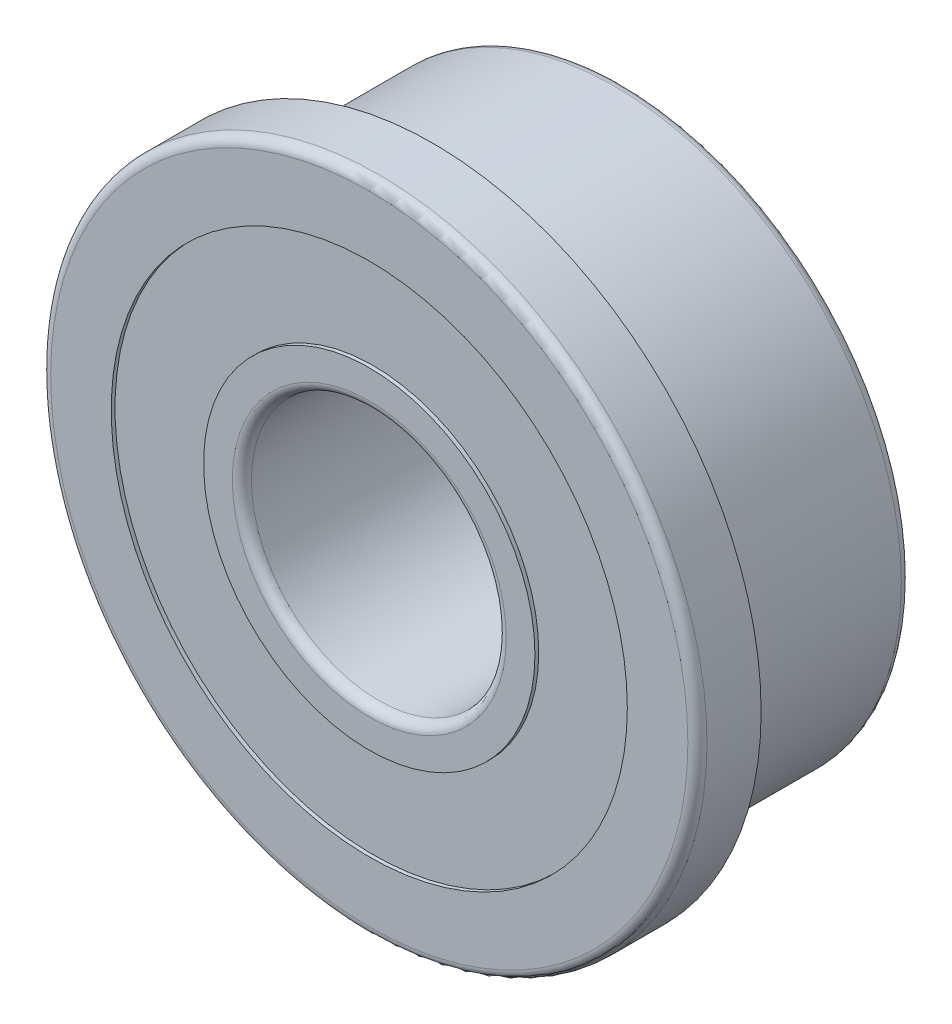
ISO-10303-21;
HEADER;
FILE_DESCRIPTION(('STEP AP214'),'2;1');
FILE_NAME('part.step','',(''),(''),'','','');
FILE_SCHEMA(('AUTOMOTIVE_DESIGN { 1 0 10303 214 1 1 1 1 }'));
ENDSEC;
DATA;
#1=APPLICATION_CONTEXT('core data for automotive mechanical design processes');
#2=APPLICATION_PROTOCOL_DEFINITION('international standard','automotive_design',2000,#1);
#3=PRODUCT_CONTEXT('',#1,'mechanical');
#4=PRODUCT('Part','Part','',(#3));
#5=PRODUCT_RELATED_PRODUCT_CATEGORY('part','',(#4));
#6=PRODUCT_DEFINITION_FORMATION('','',#4);
#7=PRODUCT_DEFINITION_CONTEXT('part definition',#1,'design');
#8=PRODUCT_DEFINITION('design','',#6,#7);
#9=PRODUCT_DEFINITION_SHAPE('','',#8);
#10=(LENGTH_UNIT() NAMED_UNIT(*) SI_UNIT(.MILLI.,.METRE.));
#11=(NAMED_UNIT(*) PLANE_ANGLE_UNIT() SI_UNIT($,.RADIAN.));
#12=(NAMED_UNIT(*) SI_UNIT($,.STERADIAN.) SOLID_ANGLE_UNIT());
#13=UNCERTAINTY_MEASURE_WITH_UNIT(LENGTH_MEASURE(1.E-05),#10,'distance_accuracy_value','');
#14=(GEOMETRIC_REPRESENTATION_CONTEXT(3) GLOBAL_UNCERTAINTY_ASSIGNED_CONTEXT((#13)) GLOBAL_UNIT_ASSIGNED_CONTEXT((#10,
#11,#12)) REPRESENTATION_CONTEXT('',''));
#15=CARTESIAN_POINT('',(0.,0.,0.));
#16=DIRECTION('',(0.,0.,1.));
#17=DIRECTION('',(1.,0.,0.));
#18=AXIS2_PLACEMENT_3D('',#15,#16,#17);
#19=CARTESIAN_POINT('',(0.,0.,0.));
#20=DIRECTION('',(0.,0.,1.));
#21=DIRECTION('',(1.,0.,0.));
#22=AXIS2_PLACEMENT_3D('',#19,#20,#21);
#23=PLANE('',#22);
#24=CARTESIAN_POINT('',(0.,0.,0.));
#25=DIRECTION('',(0.,0.,1.));
#26=DIRECTION('',(1.,0.,0.));
#27=AXIS2_PLACEMENT_3D('',#24,#25,#26);
#28=CIRCLE('',#27,2.15);
#29=CARTESIAN_POINT('',(2.15,0.,0.));
#30=VERTEX_POINT('',#29);
#31=EDGE_CURVE('E61',#30,#30,#28,.T.);
#32=ORIENTED_EDGE('',*,*,#31,.T.);
#33=EDGE_LOOP('',(#32));
#34=FACE_BOUND('',#33,.T.);
#35=CARTESIAN_POINT('',(0.,0.,0.));
#36=DIRECTION('',(0.,0.,-1.));
#37=DIRECTION('',(-1.,0.,0.));
#38=AXIS2_PLACEMENT_3D('',#35,#36,#37);
#39=CIRCLE('',#38,2.6);
#40=CARTESIAN_POINT('',(-2.6,0.,0.));
#41=VERTEX_POINT('',#40);
#42=EDGE_CURVE('E89',#41,#41,#39,.T.);
#43=ORIENTED_EDGE('',*,*,#42,.T.);
#44=EDGE_LOOP('',(#43));
#45=FACE_BOUND('',#44,.T.);
#46=ADVANCED_FACE('F32',(#34,#45),#23,.F.);
#47=CARTESIAN_POINT('',(0.,0.,4.));
#48=DIRECTION('',(0.,0.,1.));
#49=DIRECTION('',(1.,0.,0.));
#50=AXIS2_PLACEMENT_3D('',#47,#48,#49);
#51=PLANE('',#50);
#52=CARTESIAN_POINT('',(0.,0.,4.));
#53=DIRECTION('',(0.,0.,1.));
#54=DIRECTION('',(1.,0.,0.));
#55=AXIS2_PLACEMENT_3D('',#52,#53,#54);
#56=CIRCLE('',#55,2.15);
#57=CARTESIAN_POINT('',(2.15,0.,4.));
#58=VERTEX_POINT('',#57);
#59=EDGE_CURVE('E43',#58,#58,#56,.F.);
#60=ORIENTED_EDGE('',*,*,#59,.T.);
#61=EDGE_LOOP('',(#60));
#62=FACE_BOUND('',#61,.T.);
#63=CARTESIAN_POINT('',(0.,0.,4.));
#64=DIRECTION('',(0.,0.,1.));
#65=DIRECTION('',(1.,0.,0.));
#66=AXIS2_PLACEMENT_3D('',#63,#64,#65);
#67=CIRCLE('',#66,2.6);
#68=CARTESIAN_POINT('',(2.6,0.,4.));
#69=VERTEX_POINT('',#68);
#70=EDGE_CURVE('E77',#69,#69,#67,.T.);
#71=ORIENTED_EDGE('',*,*,#70,.T.);
#72=EDGE_LOOP('',(#71));
#73=FACE_BOUND('',#72,.T.);
#74=ADVANCED_FACE('F123',(#62,#73),#51,.T.);
#75=CARTESIAN_POINT('',(0.,0.,3.));
#76=DIRECTION('',(0.,0.,-1.));
#77=DIRECTION('',(-1.,0.,0.));
#78=AXIS2_PLACEMENT_3D('',#75,#76,#77);
#79=CYLINDRICAL_SURFACE('',#78,4.5);
#80=CARTESIAN_POINT('',(0.,0.,0.15));
#81=DIRECTION('',(0.,0.,1.));
#82=DIRECTION('',(1.,0.,0.));
#83=AXIS2_PLACEMENT_3D('',#80,#81,#82);
#84=CIRCLE('',#83,4.5);
#85=CARTESIAN_POINT('',(4.5,0.,0.15));
#86=VERTEX_POINT('',#85);
#87=EDGE_CURVE('E52',#86,#86,#84,.T.);
#88=ORIENTED_EDGE('',*,*,#87,.T.);
#89=EDGE_LOOP('',(#88));
#90=FACE_BOUND('',#89,.T.);
#91=CARTESIAN_POINT('',(0.,0.,3.));
#92=DIRECTION('',(0.,0.,1.));
#93=DIRECTION('',(1.,0.,0.));
#94=AXIS2_PLACEMENT_3D('',#91,#92,#93);
#95=CIRCLE('',#94,4.5);
#96=CARTESIAN_POINT('',(4.5,0.,3.));
#97=VERTEX_POINT('',#96);
#98=EDGE_CURVE('E64',#97,#97,#95,.T.);
#99=ORIENTED_EDGE('',*,*,#98,.F.);
#100=EDGE_LOOP('',(#99));
#101=FACE_BOUND('',#100,.T.);
#102=ADVANCED_FACE('F114',(#90,#101),#79,.T.);
#103=CARTESIAN_POINT('',(0.,0.,0.));
#104=DIRECTION('',(0.,0.,1.));
#105=DIRECTION('',(1.,0.,0.));
#106=AXIS2_PLACEMENT_3D('',#103,#104,#105);
#107=CIRCLE('',#106,4.35);
#108=CARTESIAN_POINT('',(4.35,0.,0.));
#109=VERTEX_POINT('',#108);
#110=EDGE_CURVE('E47',#109,#109,#107,.F.);
#111=ORIENTED_EDGE('',*,*,#110,.T.);
#112=EDGE_LOOP('',(#111));
#113=FACE_BOUND('',#112,.T.);
#114=CARTESIAN_POINT('',(0.,0.,0.));
#115=DIRECTION('',(0.,0.,-1.));
#116=DIRECTION('',(-1.,0.,0.));
#117=AXIS2_PLACEMENT_3D('',#114,#115,#116);
#118=CIRCLE('',#117,4.05);
#119=CARTESIAN_POINT('',(-4.05,0.,0.));
#120=VERTEX_POINT('',#119);
#121=EDGE_CURVE('E83',#120,#120,#118,.T.);
#122=ORIENTED_EDGE('',*,*,#121,.F.);
#123=EDGE_LOOP('',(#122));
#124=FACE_BOUND('',#123,.T.);
#125=ADVANCED_FACE('F111',(#113,#124),#23,.F.);
#126=CARTESIAN_POINT('',(0.,0.,4.));
#127=DIRECTION('',(0.,0.,-1.));
#128=DIRECTION('',(-1.,0.,0.));
#129=AXIS2_PLACEMENT_3D('',#126,#127,#128);
#130=CYLINDRICAL_SURFACE('',#129,5.15);
#131=CARTESIAN_POINT('',(0.,0.,3.85));
#132=DIRECTION('',(0.,0.,1.));
#133=DIRECTION('',(1.,0.,0.));
#134=AXIS2_PLACEMENT_3D('',#131,#132,#133);
#135=CIRCLE('',#134,5.15);
#136=CARTESIAN_POINT('',(5.15,0.,3.85));
#137=VERTEX_POINT('',#136);
#138=EDGE_CURVE('E10',#137,#137,#135,.F.);
#139=ORIENTED_EDGE('',*,*,#138,.T.);
#140=EDGE_LOOP('',(#139));
#141=FACE_BOUND('',#140,.T.);
#142=CARTESIAN_POINT('',(0.,0.,3.));
#143=DIRECTION('',(0.,0.,1.));
#144=DIRECTION('',(1.,0.,0.));
#145=AXIS2_PLACEMENT_3D('',#142,#143,#144);
#146=CIRCLE('',#145,5.15);
#147=CARTESIAN_POINT('',(5.15,0.,3.));
#148=VERTEX_POINT('',#147);
#149=EDGE_CURVE('E67',#148,#148,#146,.T.);
#150=ORIENTED_EDGE('',*,*,#149,.T.);
#151=EDGE_LOOP('',(#150));
#152=FACE_BOUND('',#151,.T.);
#153=ADVANCED_FACE('F113',(#141,#152),#130,.T.);
#154=CARTESIAN_POINT('',(0.,0.,4.));
#155=DIRECTION('',(0.,0.,1.));
#156=DIRECTION('',(1.,0.,0.));
#157=AXIS2_PLACEMENT_3D('',#154,#155,#156);
#158=CIRCLE('',#157,5.);
#159=CARTESIAN_POINT('',(5.,0.,4.));
#160=VERTEX_POINT('',#159);
#161=EDGE_CURVE('E39',#160,#160,#158,.T.);
#162=ORIENTED_EDGE('',*,*,#161,.T.);
#163=EDGE_LOOP('',(#162));
#164=FACE_BOUND('',#163,.T.);
#165=CARTESIAN_POINT('',(0.,0.,4.));
#166=DIRECTION('',(0.,0.,1.));
#167=DIRECTION('',(1.,0.,0.));
#168=AXIS2_PLACEMENT_3D('',#165,#166,#167);
#169=CIRCLE('',#168,4.05);
#170=CARTESIAN_POINT('',(4.05,0.,4.));
#171=VERTEX_POINT('',#170);
#172=EDGE_CURVE('E71',#171,#171,#169,.T.);
#173=ORIENTED_EDGE('',*,*,#172,.F.);
#174=EDGE_LOOP('',(#173));
#175=FACE_BOUND('',#174,.T.);
#176=ADVANCED_FACE('F121',(#164,#175),#51,.T.);
#177=CARTESIAN_POINT('',(0.,0.,3.));
#178=DIRECTION('',(0.,0.,1.));
#179=DIRECTION('',(1.,0.,0.));
#180=AXIS2_PLACEMENT_3D('',#177,#178,#179);
#181=PLANE('',#180);
#182=ORIENTED_EDGE('',*,*,#98,.T.);
#183=EDGE_LOOP('',(#182));
#184=FACE_BOUND('',#183,.T.);
#185=ORIENTED_EDGE('',*,*,#149,.F.);
#186=EDGE_LOOP('',(#185));
#187=FACE_BOUND('',#186,.T.);
#188=ADVANCED_FACE('F159',(#184,#187),#181,.F.);
#189=CARTESIAN_POINT('',(0.,0.,0.));
#190=DIRECTION('',(0.,0.,1.));
#191=DIRECTION('',(1.,0.,0.));
#192=AXIS2_PLACEMENT_3D('',#189,#190,#191);
#193=CYLINDRICAL_SURFACE('',#192,2.);
#194=CARTESIAN_POINT('',(0.,0.,0.15));
#195=DIRECTION('',(0.,0.,1.));
#196=DIRECTION('',(1.,0.,0.));
#197=AXIS2_PLACEMENT_3D('',#194,#195,#196);
#198=CIRCLE('',#197,2.);
#199=CARTESIAN_POINT('',(2.,0.,0.15));
#200=VERTEX_POINT('',#199);
#201=EDGE_CURVE('E55',#200,#200,#198,.F.);
#202=ORIENTED_EDGE('',*,*,#201,.T.);
#203=EDGE_LOOP('',(#202));
#204=FACE_BOUND('',#203,.T.);
#205=CARTESIAN_POINT('',(0.,0.,3.85));
#206=DIRECTION('',(0.,0.,1.));
#207=DIRECTION('',(1.,0.,0.));
#208=AXIS2_PLACEMENT_3D('',#205,#206,#207);
#209=CIRCLE('',#208,2.);
#210=CARTESIAN_POINT('',(2.,0.,3.85));
#211=VERTEX_POINT('',#210);
#212=EDGE_CURVE('E58',#211,#211,#209,.T.);
#213=ORIENTED_EDGE('',*,*,#212,.T.);
#214=EDGE_LOOP('',(#213));
#215=FACE_BOUND('',#214,.T.);
#216=ADVANCED_FACE('F156',(#204,#215),#193,.F.);
#217=CARTESIAN_POINT('',(0.,0.,3.94));
#218=DIRECTION('',(0.,0.,1.));
#219=DIRECTION('',(1.,0.,0.));
#220=AXIS2_PLACEMENT_3D('',#217,#218,#219);
#221=CYLINDRICAL_SURFACE('',#220,4.05);
#222=CARTESIAN_POINT('',(0.,0.,3.94));
#223=DIRECTION('',(0.,0.,1.));
#224=DIRECTION('',(1.,0.,0.));
#225=AXIS2_PLACEMENT_3D('',#222,#223,#224);
#226=CIRCLE('',#225,4.05);
#227=CARTESIAN_POINT('',(4.05,0.,3.94));
#228=VERTEX_POINT('',#227);
#229=EDGE_CURVE('E70',#228,#228,#226,.T.);
#230=ORIENTED_EDGE('',*,*,#229,.F.);
#231=EDGE_LOOP('',(#230));
#232=FACE_BOUND('',#231,.T.);
#233=ORIENTED_EDGE('',*,*,#172,.T.);
#234=EDGE_LOOP('',(#233));
#235=FACE_BOUND('',#234,.T.);
#236=ADVANCED_FACE('F152',(#232,#235),#221,.F.);
#237=CARTESIAN_POINT('',(0.,0.,3.94));
#238=DIRECTION('',(0.,0.,1.));
#239=DIRECTION('',(1.,0.,0.));
#240=AXIS2_PLACEMENT_3D('',#237,#238,#239);
#241=PLANE('',#240);
#242=CARTESIAN_POINT('',(0.,0.,3.94));
#243=DIRECTION('',(0.,0.,1.));
#244=DIRECTION('',(1.,0.,0.));
#245=AXIS2_PLACEMENT_3D('',#242,#243,#244);
#246=CIRCLE('',#245,2.6);
#247=CARTESIAN_POINT('',(2.6,0.,3.94));
#248=VERTEX_POINT('',#247);
#249=EDGE_CURVE('E74',#248,#248,#246,.T.);
#250=ORIENTED_EDGE('',*,*,#249,.F.);
#251=EDGE_LOOP('',(#250));
#252=FACE_BOUND('',#251,.T.);
#253=ORIENTED_EDGE('',*,*,#229,.T.);
#254=EDGE_LOOP('',(#253));
#255=FACE_BOUND('',#254,.T.);
#256=ADVANCED_FACE('F148',(#252,#255),#241,.T.);
#257=CARTESIAN_POINT('',(0.,0.,3.94));
#258=DIRECTION('',(0.,0.,1.));
#259=DIRECTION('',(1.,0.,0.));
#260=AXIS2_PLACEMENT_3D('',#257,#258,#259);
#261=CYLINDRICAL_SURFACE('',#260,2.6);
#262=ORIENTED_EDGE('',*,*,#249,.T.);
#263=EDGE_LOOP('',(#262));
#264=FACE_BOUND('',#263,.T.);
#265=ORIENTED_EDGE('',*,*,#70,.F.);
#266=EDGE_LOOP('',(#265));
#267=FACE_BOUND('',#266,.T.);
#268=ADVANCED_FACE('F107',(#264,#267),#261,.T.);
#269=CARTESIAN_POINT('',(0.,0.,0.06));
#270=DIRECTION('',(0.,0.,-1.));
#271=DIRECTION('',(-1.,0.,0.));
#272=AXIS2_PLACEMENT_3D('',#269,#270,#271);
#273=CYLINDRICAL_SURFACE('',#272,4.05);
#274=CARTESIAN_POINT('',(0.,0.,0.06));
#275=DIRECTION('',(0.,0.,-1.));
#276=DIRECTION('',(-1.,0.,0.));
#277=AXIS2_PLACEMENT_3D('',#274,#275,#276);
#278=CIRCLE('',#277,4.05);
#279=CARTESIAN_POINT('',(-4.05,0.,0.06));
#280=VERTEX_POINT('',#279);
#281=EDGE_CURVE('E80',#280,#280,#278,.T.);
#282=ORIENTED_EDGE('',*,*,#281,.F.);
#283=EDGE_LOOP('',(#282));
#284=FACE_BOUND('',#283,.T.);
#285=ORIENTED_EDGE('',*,*,#121,.T.);
#286=EDGE_LOOP('',(#285));
#287=FACE_BOUND('',#286,.T.);
#288=ADVANCED_FACE('F101',(#284,#287),#273,.F.);
#289=CARTESIAN_POINT('',(0.,0.,0.06));
#290=DIRECTION('',(0.,0.,-1.));
#291=DIRECTION('',(-1.,0.,0.));
#292=AXIS2_PLACEMENT_3D('',#289,#290,#291);
#293=PLANE('',#292);
#294=CARTESIAN_POINT('',(0.,0.,0.06));
#295=DIRECTION('',(0.,0.,-1.));
#296=DIRECTION('',(-1.,0.,0.));
#297=AXIS2_PLACEMENT_3D('',#294,#295,#296);
#298=CIRCLE('',#297,2.6);
#299=CARTESIAN_POINT('',(-2.6,0.,0.06));
#300=VERTEX_POINT('',#299);
#301=EDGE_CURVE('E86',#300,#300,#298,.T.);
#302=ORIENTED_EDGE('',*,*,#301,.F.);
#303=EDGE_LOOP('',(#302));
#304=FACE_BOUND('',#303,.T.);
#305=ORIENTED_EDGE('',*,*,#281,.T.);
#306=EDGE_LOOP('',(#305));
#307=FACE_BOUND('',#306,.T.);
#308=ADVANCED_FACE('F98',(#304,#307),#293,.T.);
#309=CARTESIAN_POINT('',(0.,0.,0.06));
#310=DIRECTION('',(0.,0.,-1.));
#311=DIRECTION('',(-1.,0.,0.));
#312=AXIS2_PLACEMENT_3D('',#309,#310,#311);
#313=CYLINDRICAL_SURFACE('',#312,2.6);
#314=ORIENTED_EDGE('',*,*,#301,.T.);
#315=EDGE_LOOP('',(#314));
#316=FACE_BOUND('',#315,.T.);
#317=ORIENTED_EDGE('',*,*,#42,.F.);
#318=EDGE_LOOP('',(#317));
#319=FACE_BOUND('',#318,.T.);
#320=ADVANCED_FACE('F95',(#316,#319),#313,.T.);
#321=CARTESIAN_POINT('',(0.,0.,0.15));
#322=DIRECTION('',(0.,0.,1.));
#323=DIRECTION('',(1.,0.,0.));
#324=AXIS2_PLACEMENT_3D('',#321,#322,#323);
#325=TOROIDAL_SURFACE('',#324,2.15,0.15);
#326=ORIENTED_EDGE('',*,*,#201,.F.);
#327=EDGE_LOOP('',(#326));
#328=FACE_BOUND('',#327,.T.);
#329=ORIENTED_EDGE('',*,*,#31,.F.);
#330=EDGE_LOOP('',(#329));
#331=FACE_BOUND('',#330,.T.);
#332=ADVANCED_FACE('F137',(#328,#331),#325,.T.);
#333=CARTESIAN_POINT('',(0.,0.,0.15));
#334=DIRECTION('',(0.,0.,1.));
#335=DIRECTION('',(1.,0.,0.));
#336=AXIS2_PLACEMENT_3D('',#333,#334,#335);
#337=TOROIDAL_SURFACE('',#336,4.35,0.15);
#338=ORIENTED_EDGE('',*,*,#110,.F.);
#339=EDGE_LOOP('',(#338));
#340=FACE_BOUND('',#339,.T.);
#341=ORIENTED_EDGE('',*,*,#87,.F.);
#342=EDGE_LOOP('',(#341));
#343=FACE_BOUND('',#342,.T.);
#344=ADVANCED_FACE('F142',(#340,#343),#337,.T.);
#345=CARTESIAN_POINT('',(0.,0.,3.85));
#346=DIRECTION('',(0.,0.,1.));
#347=DIRECTION('',(1.,0.,0.));
#348=AXIS2_PLACEMENT_3D('',#345,#346,#347);
#349=TOROIDAL_SURFACE('',#348,2.15,0.15);
#350=ORIENTED_EDGE('',*,*,#59,.F.);
#351=EDGE_LOOP('',(#350));
#352=FACE_BOUND('',#351,.T.);
#353=ORIENTED_EDGE('',*,*,#212,.F.);
#354=EDGE_LOOP('',(#353));
#355=FACE_BOUND('',#354,.T.);
#356=ADVANCED_FACE('F259',(#352,#355),#349,.T.);
#357=CARTESIAN_POINT('',(0.,0.,3.85));
#358=DIRECTION('',(0.,0.,1.));
#359=DIRECTION('',(1.,0.,0.));
#360=AXIS2_PLACEMENT_3D('',#357,#358,#359);
#361=TOROIDAL_SURFACE('',#360,5.,0.15);
#362=ORIENTED_EDGE('',*,*,#138,.F.);
#363=EDGE_LOOP('',(#362));
#364=FACE_BOUND('',#363,.T.);
#365=ORIENTED_EDGE('',*,*,#161,.F.);
#366=EDGE_LOOP('',(#365));
#367=FACE_BOUND('',#366,.T.);
#368=ADVANCED_FACE('F34',(#364,#367),#361,.T.);
#369=CLOSED_SHELL('',(#46,#74,#102,#125,#153,#176,#188,#216,#236,#256,#268,#288,#308,#320,#332,
#344,#356,#368));
#370=MANIFOLD_SOLID_BREP('B2',#369);
#371=ADVANCED_BREP_SHAPE_REPRESENTATION('',(#18,#370),#14);
#372=SHAPE_DEFINITION_REPRESENTATION(#9,#371);
ENDSEC;
END-ISO-10303-21;
